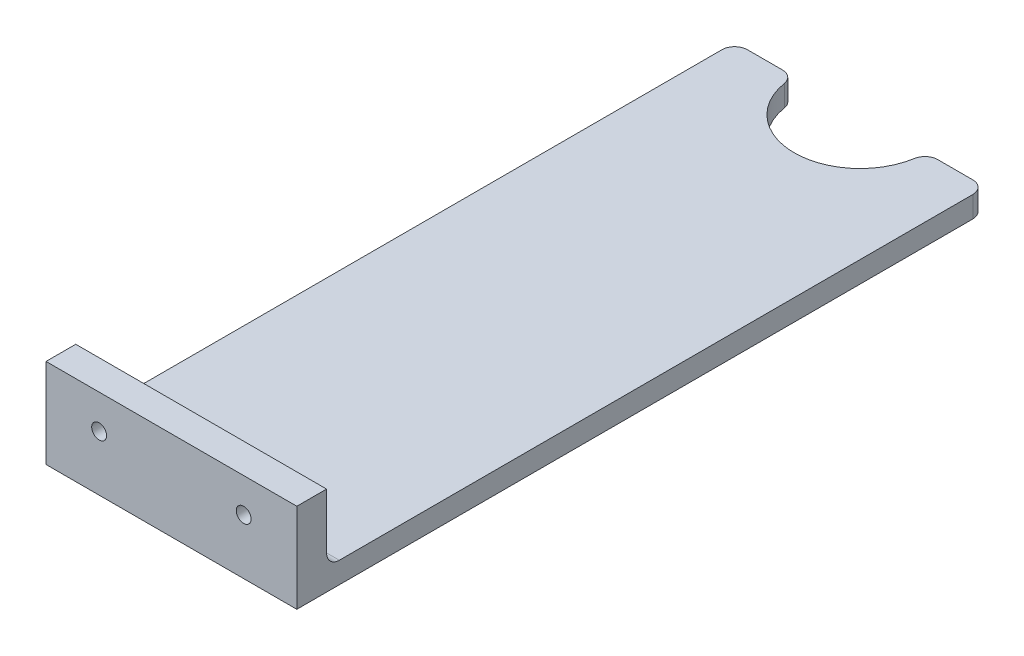
ISO-10303-21;
HEADER;
FILE_DESCRIPTION(('STEP AP214'),'2;1');
FILE_NAME('part.step','',(''),(''),'','','');
FILE_SCHEMA(('AUTOMOTIVE_DESIGN { 1 0 10303 214 1 1 1 1 }'));
ENDSEC;
DATA;
#1=APPLICATION_CONTEXT('core data for automotive mechanical design processes');
#2=APPLICATION_PROTOCOL_DEFINITION('international standard','automotive_design',2000,#1);
#3=PRODUCT_CONTEXT('',#1,'mechanical');
#4=PRODUCT('Part','Part','',(#3));
#5=PRODUCT_RELATED_PRODUCT_CATEGORY('part','',(#4));
#6=PRODUCT_DEFINITION_FORMATION('','',#4);
#7=PRODUCT_DEFINITION_CONTEXT('part definition',#1,'design');
#8=PRODUCT_DEFINITION('design','',#6,#7);
#9=PRODUCT_DEFINITION_SHAPE('','',#8);
#10=(LENGTH_UNIT() NAMED_UNIT(*) SI_UNIT(.MILLI.,.METRE.));
#11=(NAMED_UNIT(*) PLANE_ANGLE_UNIT() SI_UNIT($,.RADIAN.));
#12=(NAMED_UNIT(*) SI_UNIT($,.STERADIAN.) SOLID_ANGLE_UNIT());
#13=UNCERTAINTY_MEASURE_WITH_UNIT(LENGTH_MEASURE(1.E-05),#10,'distance_accuracy_value','');
#14=(GEOMETRIC_REPRESENTATION_CONTEXT(3) GLOBAL_UNCERTAINTY_ASSIGNED_CONTEXT((#13)) GLOBAL_UNIT_ASSIGNED_CONTEXT((#10,
#11,#12)) REPRESENTATION_CONTEXT('',''));
#15=CARTESIAN_POINT('',(0.,0.,0.));
#16=DIRECTION('',(0.,0.,1.));
#17=DIRECTION('',(1.,0.,0.));
#18=AXIS2_PLACEMENT_3D('',#15,#16,#17);
#19=CARTESIAN_POINT('',(0.,0.,-155.));
#20=DIRECTION('',(0.,0.,1.));
#21=DIRECTION('',(1.,0.,0.));
#22=AXIS2_PLACEMENT_3D('',#19,#20,#21);
#23=PLANE('',#22);
#24=DIRECTION('',(1.,0.,0.));
#25=VECTOR('',#24,1.);
#26=CARTESIAN_POINT('',(29.5,-8.,-155.));
#27=LINE('',#26,#25);
#28=CARTESIAN_POINT('',(18.2551362635287,-8.,-155.));
#29=VERTEX_POINT('',#28);
#30=CARTESIAN_POINT('',(26.5,-8.,-155.));
#31=VERTEX_POINT('',#30);
#32=EDGE_CURVE('E247',#29,#31,#27,.T.);
#33=ORIENTED_EDGE('',*,*,#32,.T.);
#34=DIRECTION('',(0.,-1.,0.));
#35=VECTOR('',#34,1.);
#36=CARTESIAN_POINT('',(26.5,0.,-155.));
#37=LINE('',#36,#35);
#38=CARTESIAN_POINT('',(26.5,-13.,-155.));
#39=VERTEX_POINT('',#38);
#40=EDGE_CURVE('E219',#31,#39,#37,.T.);
#41=ORIENTED_EDGE('',*,*,#40,.T.);
#42=DIRECTION('',(-1.,0.,0.));
#43=VECTOR('',#42,1.);
#44=CARTESIAN_POINT('',(29.5,-13.,-155.));
#45=LINE('',#44,#43);
#46=CARTESIAN_POINT('',(18.2551362635287,-13.,-155.));
#47=VERTEX_POINT('',#46);
#48=EDGE_CURVE('E249',#39,#47,#45,.T.);
#49=ORIENTED_EDGE('',*,*,#48,.T.);
#50=DIRECTION('',(0.,1.,0.));
#51=VECTOR('',#50,1.);
#52=CARTESIAN_POINT('',(18.2551362635287,0.,-155.));
#53=LINE('',#52,#51);
#54=EDGE_CURVE('E215',#47,#29,#53,.T.);
#55=ORIENTED_EDGE('',*,*,#54,.T.);
#56=EDGE_LOOP('',(#33,#41,#49,#55));
#57=FACE_BOUND('',#56,.T.);
#58=ADVANCED_FACE('F39',(#57),#23,.F.);
#59=CARTESIAN_POINT('',(0.,0.,7.));
#60=DIRECTION('',(0.,0.,-1.));
#61=DIRECTION('',(-1.,0.,0.));
#62=AXIS2_PLACEMENT_3D('',#59,#60,#61);
#63=PLANE('',#62);
#64=DIRECTION('',(0.,1.,0.));
#65=VECTOR('',#64,1.);
#66=CARTESIAN_POINT('',(29.5,-13.,7.));
#67=LINE('',#66,#65);
#68=CARTESIAN_POINT('',(29.5,-13.,7.));
#69=VERTEX_POINT('',#68);
#70=CARTESIAN_POINT('',(29.5,8.,7.));
#71=VERTEX_POINT('',#70);
#72=EDGE_CURVE('E147',#69,#71,#67,.T.);
#73=ORIENTED_EDGE('',*,*,#72,.T.);
#74=DIRECTION('',(-1.,0.,0.));
#75=VECTOR('',#74,1.);
#76=CARTESIAN_POINT('',(-29.5,8.,7.));
#77=LINE('',#76,#75);
#78=CARTESIAN_POINT('',(-29.5,8.,7.));
#79=VERTEX_POINT('',#78);
#80=EDGE_CURVE('E136',#71,#79,#77,.T.);
#81=ORIENTED_EDGE('',*,*,#80,.T.);
#82=DIRECTION('',(0.,-1.,0.));
#83=VECTOR('',#82,1.);
#84=CARTESIAN_POINT('',(-29.5,-13.,7.));
#85=LINE('',#84,#83);
#86=CARTESIAN_POINT('',(-29.5,-13.,7.));
#87=VERTEX_POINT('',#86);
#88=EDGE_CURVE('E146',#79,#87,#85,.T.);
#89=ORIENTED_EDGE('',*,*,#88,.T.);
#90=DIRECTION('',(1.,0.,0.));
#91=VECTOR('',#90,1.);
#92=CARTESIAN_POINT('',(-29.5,-13.,7.));
#93=LINE('',#92,#91);
#94=EDGE_CURVE('E153',#87,#69,#93,.T.);
#95=ORIENTED_EDGE('',*,*,#94,.T.);
#96=EDGE_LOOP('',(#73,#81,#89,#95));
#97=FACE_BOUND('',#96,.T.);
#98=CARTESIAN_POINT('',(-17.,0.,7.));
#99=DIRECTION('',(0.,0.,1.));
#100=DIRECTION('',(1.,0.,0.));
#101=AXIS2_PLACEMENT_3D('',#98,#99,#100);
#102=CIRCLE('',#101,1.75);
#103=CARTESIAN_POINT('',(-15.25,0.,7.));
#104=VERTEX_POINT('',#103);
#105=EDGE_CURVE('E279',#104,#104,#102,.T.);
#106=ORIENTED_EDGE('',*,*,#105,.F.);
#107=EDGE_LOOP('',(#106));
#108=FACE_BOUND('',#107,.T.);
#109=CARTESIAN_POINT('',(17.,0.,7.));
#110=DIRECTION('',(0.,0.,1.));
#111=DIRECTION('',(1.,0.,0.));
#112=AXIS2_PLACEMENT_3D('',#109,#110,#111);
#113=CIRCLE('',#112,1.75);
#114=CARTESIAN_POINT('',(18.75,0.,7.));
#115=VERTEX_POINT('',#114);
#116=EDGE_CURVE('E271',#115,#115,#113,.T.);
#117=ORIENTED_EDGE('',*,*,#116,.F.);
#118=EDGE_LOOP('',(#117));
#119=FACE_BOUND('',#118,.T.);
#120=ADVANCED_FACE('F150',(#97,#108,#119),#63,.F.);
#121=CARTESIAN_POINT('',(0.,0.,0.));
#122=DIRECTION('',(0.,0.,-1.));
#123=DIRECTION('',(-1.,0.,0.));
#124=AXIS2_PLACEMENT_3D('',#121,#122,#123);
#125=PLANE('',#124);
#126=DIRECTION('',(0.,1.,0.));
#127=VECTOR('',#126,1.);
#128=CARTESIAN_POINT('',(29.5,-13.,0.));
#129=LINE('',#128,#127);
#130=CARTESIAN_POINT('',(29.5,-5.,0.));
#131=VERTEX_POINT('',#130);
#132=CARTESIAN_POINT('',(29.5,8.,0.));
#133=VERTEX_POINT('',#132);
#134=EDGE_CURVE('E160',#131,#133,#129,.T.);
#135=ORIENTED_EDGE('',*,*,#134,.F.);
#136=DIRECTION('',(1.,0.,0.));
#137=VECTOR('',#136,1.);
#138=CARTESIAN_POINT('',(0.,-5.,0.));
#139=LINE('',#138,#137);
#140=CARTESIAN_POINT('',(-29.5,-5.,0.));
#141=VERTEX_POINT('',#140);
#142=EDGE_CURVE('E168',#131,#141,#139,.F.);
#143=ORIENTED_EDGE('',*,*,#142,.T.);
#144=DIRECTION('',(0.,-1.,0.));
#145=VECTOR('',#144,1.);
#146=CARTESIAN_POINT('',(-29.5,-13.,0.));
#147=LINE('',#146,#145);
#148=CARTESIAN_POINT('',(-29.5,8.,0.));
#149=VERTEX_POINT('',#148);
#150=EDGE_CURVE('E156',#149,#141,#147,.T.);
#151=ORIENTED_EDGE('',*,*,#150,.F.);
#152=DIRECTION('',(-1.,0.,0.));
#153=VECTOR('',#152,1.);
#154=CARTESIAN_POINT('',(-29.5,8.,0.));
#155=LINE('',#154,#153);
#156=EDGE_CURVE('E293',#133,#149,#155,.T.);
#157=ORIENTED_EDGE('',*,*,#156,.F.);
#158=EDGE_LOOP('',(#135,#143,#151,#157));
#159=FACE_BOUND('',#158,.T.);
#160=CARTESIAN_POINT('',(-17.,0.,0.));
#161=DIRECTION('',(0.,0.,1.));
#162=DIRECTION('',(1.,0.,0.));
#163=AXIS2_PLACEMENT_3D('',#160,#161,#162);
#164=CIRCLE('',#163,1.75);
#165=CARTESIAN_POINT('',(-15.25,0.,0.));
#166=VERTEX_POINT('',#165);
#167=EDGE_CURVE('E275',#166,#166,#164,.T.);
#168=ORIENTED_EDGE('',*,*,#167,.T.);
#169=EDGE_LOOP('',(#168));
#170=FACE_BOUND('',#169,.T.);
#171=CARTESIAN_POINT('',(17.,0.,0.));
#172=DIRECTION('',(0.,0.,1.));
#173=DIRECTION('',(1.,0.,0.));
#174=AXIS2_PLACEMENT_3D('',#171,#172,#173);
#175=CIRCLE('',#174,1.75);
#176=CARTESIAN_POINT('',(18.75,0.,0.));
#177=VERTEX_POINT('',#176);
#178=EDGE_CURVE('E270',#177,#177,#175,.T.);
#179=ORIENTED_EDGE('',*,*,#178,.T.);
#180=EDGE_LOOP('',(#179));
#181=FACE_BOUND('',#180,.T.);
#182=ADVANCED_FACE('F330',(#159,#170,#181),#125,.T.);
#183=CARTESIAN_POINT('',(29.5,-13.,7.));
#184=DIRECTION('',(-1.,0.,0.));
#185=DIRECTION('',(0.,0.,1.));
#186=AXIS2_PLACEMENT_3D('',#183,#184,#185);
#187=PLANE('',#186);
#188=DIRECTION('',(0.,0.,-1.));
#189=VECTOR('',#188,1.);
#190=CARTESIAN_POINT('',(29.5,-13.,7.));
#191=LINE('',#190,#189);
#192=CARTESIAN_POINT('',(29.5,-13.,-152.));
#193=VERTEX_POINT('',#192);
#194=EDGE_CURVE('E290',#69,#193,#191,.T.);
#195=ORIENTED_EDGE('',*,*,#194,.T.);
#196=DIRECTION('',(0.,-1.,0.));
#197=VECTOR('',#196,1.);
#198=CARTESIAN_POINT('',(29.5,-13.,-152.));
#199=LINE('',#198,#197);
#200=CARTESIAN_POINT('',(29.5,-8.,-152.));
#201=VERTEX_POINT('',#200);
#202=EDGE_CURVE('E223',#193,#201,#199,.F.);
#203=ORIENTED_EDGE('',*,*,#202,.T.);
#204=DIRECTION('',(0.,0.,1.));
#205=VECTOR('',#204,1.);
#206=CARTESIAN_POINT('',(29.5,-8.,-155.));
#207=LINE('',#206,#205);
#208=CARTESIAN_POINT('',(29.5,-8.,-3.));
#209=VERTEX_POINT('',#208);
#210=EDGE_CURVE('E261',#201,#209,#207,.T.);
#211=ORIENTED_EDGE('',*,*,#210,.T.);
#212=CARTESIAN_POINT('',(29.5,-5.,-3.));
#213=DIRECTION('',(-1.,0.,0.));
#214=DIRECTION('',(0.,0.,1.));
#215=AXIS2_PLACEMENT_3D('',#212,#213,#214);
#216=CIRCLE('',#215,3.);
#217=EDGE_CURVE('E176',#209,#131,#216,.T.);
#218=ORIENTED_EDGE('',*,*,#217,.T.);
#219=ORIENTED_EDGE('',*,*,#134,.T.);
#220=DIRECTION('',(0.,0.,-1.));
#221=VECTOR('',#220,1.);
#222=CARTESIAN_POINT('',(29.5,8.,7.));
#223=LINE('',#222,#221);
#224=EDGE_CURVE('E140',#71,#133,#223,.T.);
#225=ORIENTED_EDGE('',*,*,#224,.F.);
#226=ORIENTED_EDGE('',*,*,#72,.F.);
#227=EDGE_LOOP('',(#195,#203,#211,#218,#219,#225,#226));
#228=FACE_BOUND('',#227,.T.);
#229=ADVANCED_FACE('F158',(#228),#187,.F.);
#230=CARTESIAN_POINT('',(-29.5,8.,7.));
#231=DIRECTION('',(0.,-1.,0.));
#232=DIRECTION('',(0.,0.,-1.));
#233=AXIS2_PLACEMENT_3D('',#230,#231,#232);
#234=PLANE('',#233);
#235=ORIENTED_EDGE('',*,*,#156,.T.);
#236=DIRECTION('',(0.,0.,-1.));
#237=VECTOR('',#236,1.);
#238=CARTESIAN_POINT('',(-29.5,8.,7.));
#239=LINE('',#238,#237);
#240=EDGE_CURVE('E142',#79,#149,#239,.T.);
#241=ORIENTED_EDGE('',*,*,#240,.F.);
#242=ORIENTED_EDGE('',*,*,#80,.F.);
#243=ORIENTED_EDGE('',*,*,#224,.T.);
#244=EDGE_LOOP('',(#235,#241,#242,#243));
#245=FACE_BOUND('',#244,.T.);
#246=ADVANCED_FACE('F138',(#245),#234,.F.);
#247=CARTESIAN_POINT('',(-29.5,-13.,7.));
#248=DIRECTION('',(1.,0.,0.));
#249=DIRECTION('',(0.,0.,-1.));
#250=AXIS2_PLACEMENT_3D('',#247,#248,#249);
#251=PLANE('',#250);
#252=DIRECTION('',(0.,0.,1.));
#253=VECTOR('',#252,1.);
#254=CARTESIAN_POINT('',(-29.5,-8.,-155.));
#255=LINE('',#254,#253);
#256=CARTESIAN_POINT('',(-29.5,-8.,-152.));
#257=VERTEX_POINT('',#256);
#258=CARTESIAN_POINT('',(-29.5,-8.,-3.));
#259=VERTEX_POINT('',#258);
#260=EDGE_CURVE('E267',#257,#259,#255,.T.);
#261=ORIENTED_EDGE('',*,*,#260,.F.);
#262=DIRECTION('',(0.,1.,0.));
#263=VECTOR('',#262,1.);
#264=CARTESIAN_POINT('',(-29.5,-13.,-152.));
#265=LINE('',#264,#263);
#266=CARTESIAN_POINT('',(-29.5,-13.,-152.));
#267=VERTEX_POINT('',#266);
#268=EDGE_CURVE('E202',#257,#267,#265,.F.);
#269=ORIENTED_EDGE('',*,*,#268,.T.);
#270=DIRECTION('',(0.,0.,-1.));
#271=VECTOR('',#270,1.);
#272=CARTESIAN_POINT('',(-29.5,-13.,7.));
#273=LINE('',#272,#271);
#274=EDGE_CURVE('E170',#87,#267,#273,.T.);
#275=ORIENTED_EDGE('',*,*,#274,.F.);
#276=ORIENTED_EDGE('',*,*,#88,.F.);
#277=ORIENTED_EDGE('',*,*,#240,.T.);
#278=ORIENTED_EDGE('',*,*,#150,.T.);
#279=CARTESIAN_POINT('',(-29.5,-5.,-3.));
#280=DIRECTION('',(1.,0.,0.));
#281=DIRECTION('',(0.,0.,-1.));
#282=AXIS2_PLACEMENT_3D('',#279,#280,#281);
#283=CIRCLE('',#282,3.);
#284=EDGE_CURVE('E179',#141,#259,#283,.T.);
#285=ORIENTED_EDGE('',*,*,#284,.T.);
#286=EDGE_LOOP('',(#261,#269,#275,#276,#277,#278,#285));
#287=FACE_BOUND('',#286,.T.);
#288=ADVANCED_FACE('F356',(#287),#251,.F.);
#289=CARTESIAN_POINT('',(-29.5,-13.,7.));
#290=DIRECTION('',(0.,1.,0.));
#291=DIRECTION('',(0.,0.,1.));
#292=AXIS2_PLACEMENT_3D('',#289,#290,#291);
#293=PLANE('',#292);
#294=ORIENTED_EDGE('',*,*,#274,.T.);
#295=CARTESIAN_POINT('',(-26.5,-13.,-152.));
#296=DIRECTION('',(0.,1.,0.));
#297=DIRECTION('',(0.,0.,1.));
#298=AXIS2_PLACEMENT_3D('',#295,#296,#297);
#299=CIRCLE('',#298,3.);
#300=CARTESIAN_POINT('',(-26.5,-13.,-155.));
#301=VERTEX_POINT('',#300);
#302=EDGE_CURVE('E212',#267,#301,#299,.F.);
#303=ORIENTED_EDGE('',*,*,#302,.T.);
#304=CARTESIAN_POINT('',(-18.2551362635287,-13.,-155.));
#305=VERTEX_POINT('',#304);
#306=EDGE_CURVE('E241',#305,#301,#45,.T.);
#307=ORIENTED_EDGE('',*,*,#306,.F.);
#308=CARTESIAN_POINT('',(-18.2551362635287,-13.,-152.));
#309=DIRECTION('',(0.,1.,0.));
#310=DIRECTION('',(0.,0.,1.));
#311=AXIS2_PLACEMENT_3D('',#308,#309,#310);
#312=CIRCLE('',#311,3.);
#313=CARTESIAN_POINT('',(-15.29484389647,-13.,-152.486486486486));
#314=VERTEX_POINT('',#313);
#315=EDGE_CURVE('E207',#305,#314,#312,.F.);
#316=ORIENTED_EDGE('',*,*,#315,.T.);
#317=CARTESIAN_POINT('',(0.,-13.,-155.));
#318=DIRECTION('',(0.,1.,0.));
#319=DIRECTION('',(0.,0.,1.));
#320=AXIS2_PLACEMENT_3D('',#317,#318,#319);
#321=CIRCLE('',#320,15.5);
#322=CARTESIAN_POINT('',(15.29484389647,-13.,-152.486486486486));
#323=VERTEX_POINT('',#322);
#324=EDGE_CURVE('E231',#314,#323,#321,.T.);
#325=ORIENTED_EDGE('',*,*,#324,.T.);
#326=CARTESIAN_POINT('',(18.2551362635287,-13.,-152.));
#327=DIRECTION('',(0.,1.,0.));
#328=DIRECTION('',(0.,0.,1.));
#329=AXIS2_PLACEMENT_3D('',#326,#327,#328);
#330=CIRCLE('',#329,3.);
#331=EDGE_CURVE('E61',#323,#47,#330,.F.);
#332=ORIENTED_EDGE('',*,*,#331,.T.);
#333=ORIENTED_EDGE('',*,*,#48,.F.);
#334=CARTESIAN_POINT('',(26.5,-13.,-152.));
#335=DIRECTION('',(0.,1.,0.));
#336=DIRECTION('',(0.,0.,1.));
#337=AXIS2_PLACEMENT_3D('',#334,#335,#336);
#338=CIRCLE('',#337,3.);
#339=EDGE_CURVE('E55',#39,#193,#338,.F.);
#340=ORIENTED_EDGE('',*,*,#339,.T.);
#341=ORIENTED_EDGE('',*,*,#194,.F.);
#342=ORIENTED_EDGE('',*,*,#94,.F.);
#343=EDGE_LOOP('',(#294,#303,#307,#316,#325,#332,#333,#340,#341,#342));
#344=FACE_BOUND('',#343,.T.);
#345=ADVANCED_FACE('F237',(#344),#293,.F.);
#346=CARTESIAN_POINT('',(-17.,0.,7.));
#347=DIRECTION('',(0.,0.,-1.));
#348=DIRECTION('',(-1.,0.,0.));
#349=AXIS2_PLACEMENT_3D('',#346,#347,#348);
#350=CYLINDRICAL_SURFACE('',#349,1.75);
#351=ORIENTED_EDGE('',*,*,#105,.T.);
#352=EDGE_LOOP('',(#351));
#353=FACE_BOUND('',#352,.T.);
#354=ORIENTED_EDGE('',*,*,#167,.F.);
#355=EDGE_LOOP('',(#354));
#356=FACE_BOUND('',#355,.T.);
#357=ADVANCED_FACE('F344',(#353,#356),#350,.F.);
#358=CARTESIAN_POINT('',(17.,0.,7.));
#359=DIRECTION('',(0.,0.,-1.));
#360=DIRECTION('',(-1.,0.,0.));
#361=AXIS2_PLACEMENT_3D('',#358,#359,#360);
#362=CYLINDRICAL_SURFACE('',#361,1.75);
#363=ORIENTED_EDGE('',*,*,#116,.T.);
#364=EDGE_LOOP('',(#363));
#365=FACE_BOUND('',#364,.T.);
#366=ORIENTED_EDGE('',*,*,#178,.F.);
#367=EDGE_LOOP('',(#366));
#368=FACE_BOUND('',#367,.T.);
#369=ADVANCED_FACE('F340',(#365,#368),#362,.F.);
#370=CARTESIAN_POINT('',(29.5,-8.,-155.));
#371=DIRECTION('',(0.,-1.,0.));
#372=DIRECTION('',(0.,0.,-1.));
#373=AXIS2_PLACEMENT_3D('',#370,#371,#372);
#374=PLANE('',#373);
#375=CARTESIAN_POINT('',(-26.5,-8.,-155.));
#376=VERTEX_POINT('',#375);
#377=CARTESIAN_POINT('',(-18.2551362635287,-8.,-155.));
#378=VERTEX_POINT('',#377);
#379=EDGE_CURVE('E256',#376,#378,#27,.T.);
#380=ORIENTED_EDGE('',*,*,#379,.F.);
#381=CARTESIAN_POINT('',(-26.5,-8.,-152.));
#382=DIRECTION('',(0.,-1.,0.));
#383=DIRECTION('',(0.,0.,-1.));
#384=AXIS2_PLACEMENT_3D('',#381,#382,#383);
#385=CIRCLE('',#384,3.);
#386=EDGE_CURVE('E199',#376,#257,#385,.F.);
#387=ORIENTED_EDGE('',*,*,#386,.T.);
#388=ORIENTED_EDGE('',*,*,#260,.T.);
#389=DIRECTION('',(1.,0.,0.));
#390=VECTOR('',#389,1.);
#391=CARTESIAN_POINT('',(29.5,-8.,-3.));
#392=LINE('',#391,#390);
#393=EDGE_CURVE('E163',#259,#209,#392,.T.);
#394=ORIENTED_EDGE('',*,*,#393,.T.);
#395=ORIENTED_EDGE('',*,*,#210,.F.);
#396=CARTESIAN_POINT('',(26.5,-8.,-152.));
#397=DIRECTION('',(0.,-1.,0.));
#398=DIRECTION('',(0.,0.,-1.));
#399=AXIS2_PLACEMENT_3D('',#396,#397,#398);
#400=CIRCLE('',#399,3.);
#401=EDGE_CURVE('E196',#201,#31,#400,.F.);
#402=ORIENTED_EDGE('',*,*,#401,.T.);
#403=ORIENTED_EDGE('',*,*,#32,.F.);
#404=CARTESIAN_POINT('',(18.2551362635287,-8.,-152.));
#405=DIRECTION('',(0.,-1.,0.));
#406=DIRECTION('',(0.,0.,-1.));
#407=AXIS2_PLACEMENT_3D('',#404,#405,#406);
#408=CIRCLE('',#407,3.);
#409=CARTESIAN_POINT('',(15.29484389647,-8.,-152.486486486486));
#410=VERTEX_POINT('',#409);
#411=EDGE_CURVE('E190',#29,#410,#408,.F.);
#412=ORIENTED_EDGE('',*,*,#411,.T.);
#413=CARTESIAN_POINT('',(0.,-8.,-155.));
#414=DIRECTION('',(0.,1.,0.));
#415=DIRECTION('',(0.,0.,1.));
#416=AXIS2_PLACEMENT_3D('',#413,#414,#415);
#417=CIRCLE('',#416,15.5);
#418=CARTESIAN_POINT('',(-15.29484389647,-8.,-152.486486486486));
#419=VERTEX_POINT('',#418);
#420=EDGE_CURVE('E234',#419,#410,#417,.T.);
#421=ORIENTED_EDGE('',*,*,#420,.F.);
#422=CARTESIAN_POINT('',(-18.2551362635287,-8.,-152.));
#423=DIRECTION('',(0.,-1.,0.));
#424=DIRECTION('',(0.,0.,-1.));
#425=AXIS2_PLACEMENT_3D('',#422,#423,#424);
#426=CIRCLE('',#425,3.);
#427=EDGE_CURVE('E193',#419,#378,#426,.F.);
#428=ORIENTED_EDGE('',*,*,#427,.T.);
#429=EDGE_LOOP('',(#380,#387,#388,#394,#395,#402,#403,#412,#421,#428));
#430=FACE_BOUND('',#429,.T.);
#431=ADVANCED_FACE('F252',(#430),#374,.F.);
#432=ORIENTED_EDGE('',*,*,#306,.T.);
#433=DIRECTION('',(0.,1.,0.));
#434=VECTOR('',#433,1.);
#435=CARTESIAN_POINT('',(-26.5,0.,-155.));
#436=LINE('',#435,#434);
#437=EDGE_CURVE('E186',#301,#376,#436,.T.);
#438=ORIENTED_EDGE('',*,*,#437,.T.);
#439=ORIENTED_EDGE('',*,*,#379,.T.);
#440=DIRECTION('',(0.,1.,0.));
#441=VECTOR('',#440,1.);
#442=CARTESIAN_POINT('',(-18.2551362635287,0.,-155.));
#443=LINE('',#442,#441);
#444=EDGE_CURVE('E183',#378,#305,#443,.F.);
#445=ORIENTED_EDGE('',*,*,#444,.T.);
#446=EDGE_LOOP('',(#432,#438,#439,#445));
#447=FACE_BOUND('',#446,.T.);
#448=ADVANCED_FACE('F310',(#447),#23,.F.);
#449=CARTESIAN_POINT('',(0.,-13.,-155.));
#450=DIRECTION('',(0.,1.,0.));
#451=DIRECTION('',(0.,0.,1.));
#452=AXIS2_PLACEMENT_3D('',#449,#450,#451);
#453=CYLINDRICAL_SURFACE('',#452,15.5);
#454=ORIENTED_EDGE('',*,*,#324,.F.);
#455=DIRECTION('',(0.,1.,0.));
#456=VECTOR('',#455,1.);
#457=CARTESIAN_POINT('',(-15.29484389647,-13.,-152.486486486486));
#458=LINE('',#457,#456);
#459=EDGE_CURVE('E11',#314,#419,#458,.T.);
#460=ORIENTED_EDGE('',*,*,#459,.T.);
#461=ORIENTED_EDGE('',*,*,#420,.T.);
#462=DIRECTION('',(0.,1.,0.));
#463=VECTOR('',#462,1.);
#464=CARTESIAN_POINT('',(15.29484389647,-13.,-152.486486486486));
#465=LINE('',#464,#463);
#466=EDGE_CURVE('E48',#410,#323,#465,.F.);
#467=ORIENTED_EDGE('',*,*,#466,.T.);
#468=EDGE_LOOP('',(#454,#460,#461,#467));
#469=FACE_BOUND('',#468,.T.);
#470=ADVANCED_FACE('F230',(#469),#453,.F.);
#471=CARTESIAN_POINT('',(29.5,-5.,-3.));
#472=DIRECTION('',(1.,0.,0.));
#473=DIRECTION('',(0.,0.,-1.));
#474=AXIS2_PLACEMENT_3D('',#471,#472,#473);
#475=CYLINDRICAL_SURFACE('',#474,3.);
#476=ORIENTED_EDGE('',*,*,#284,.F.);
#477=ORIENTED_EDGE('',*,*,#142,.F.);
#478=ORIENTED_EDGE('',*,*,#217,.F.);
#479=ORIENTED_EDGE('',*,*,#393,.F.);
#480=EDGE_LOOP('',(#476,#477,#478,#479));
#481=FACE_BOUND('',#480,.T.);
#482=ADVANCED_FACE('F339',(#481),#475,.F.);
#483=CARTESIAN_POINT('',(-26.5,0.,-152.));
#484=DIRECTION('',(0.,1.,0.));
#485=DIRECTION('',(0.,0.,1.));
#486=AXIS2_PLACEMENT_3D('',#483,#484,#485);
#487=CYLINDRICAL_SURFACE('',#486,3.);
#488=ORIENTED_EDGE('',*,*,#302,.F.);
#489=ORIENTED_EDGE('',*,*,#268,.F.);
#490=ORIENTED_EDGE('',*,*,#386,.F.);
#491=ORIENTED_EDGE('',*,*,#437,.F.);
#492=EDGE_LOOP('',(#488,#489,#490,#491));
#493=FACE_BOUND('',#492,.T.);
#494=ADVANCED_FACE('F308',(#493),#487,.T.);
#495=CARTESIAN_POINT('',(26.5,0.,-152.));
#496=DIRECTION('',(0.,-1.,0.));
#497=DIRECTION('',(0.,0.,-1.));
#498=AXIS2_PLACEMENT_3D('',#495,#496,#497);
#499=CYLINDRICAL_SURFACE('',#498,3.);
#500=ORIENTED_EDGE('',*,*,#401,.F.);
#501=ORIENTED_EDGE('',*,*,#202,.F.);
#502=ORIENTED_EDGE('',*,*,#339,.F.);
#503=ORIENTED_EDGE('',*,*,#40,.F.);
#504=EDGE_LOOP('',(#500,#501,#502,#503));
#505=FACE_BOUND('',#504,.T.);
#506=ADVANCED_FACE('F318',(#505),#499,.T.);
#507=CARTESIAN_POINT('',(-18.2551362635287,-13.,-152.));
#508=DIRECTION('',(0.,1.,0.));
#509=DIRECTION('',(0.,0.,1.));
#510=AXIS2_PLACEMENT_3D('',#507,#508,#509);
#511=CYLINDRICAL_SURFACE('',#510,3.);
#512=ORIENTED_EDGE('',*,*,#315,.F.);
#513=ORIENTED_EDGE('',*,*,#444,.F.);
#514=ORIENTED_EDGE('',*,*,#427,.F.);
#515=ORIENTED_EDGE('',*,*,#459,.F.);
#516=EDGE_LOOP('',(#512,#513,#514,#515));
#517=FACE_BOUND('',#516,.T.);
#518=ADVANCED_FACE('F314',(#517),#511,.T.);
#519=CARTESIAN_POINT('',(18.2551362635287,-13.,-152.));
#520=DIRECTION('',(0.,1.,0.));
#521=DIRECTION('',(0.,0.,1.));
#522=AXIS2_PLACEMENT_3D('',#519,#520,#521);
#523=CYLINDRICAL_SURFACE('',#522,3.);
#524=ORIENTED_EDGE('',*,*,#331,.F.);
#525=ORIENTED_EDGE('',*,*,#466,.F.);
#526=ORIENTED_EDGE('',*,*,#411,.F.);
#527=ORIENTED_EDGE('',*,*,#54,.F.);
#528=EDGE_LOOP('',(#524,#525,#526,#527));
#529=FACE_BOUND('',#528,.T.);
#530=ADVANCED_FACE('F41',(#529),#523,.T.);
#531=CLOSED_SHELL('',(#58,#120,#182,#229,#246,#288,#345,#357,#369,#431,#448,#470,#482,#494,#506,
#518,#530));
#532=MANIFOLD_SOLID_BREP('B2',#531);
#533=ADVANCED_BREP_SHAPE_REPRESENTATION('',(#18,#532),#14);
#534=SHAPE_DEFINITION_REPRESENTATION(#9,#533);
ENDSEC;
END-ISO-10303-21;
